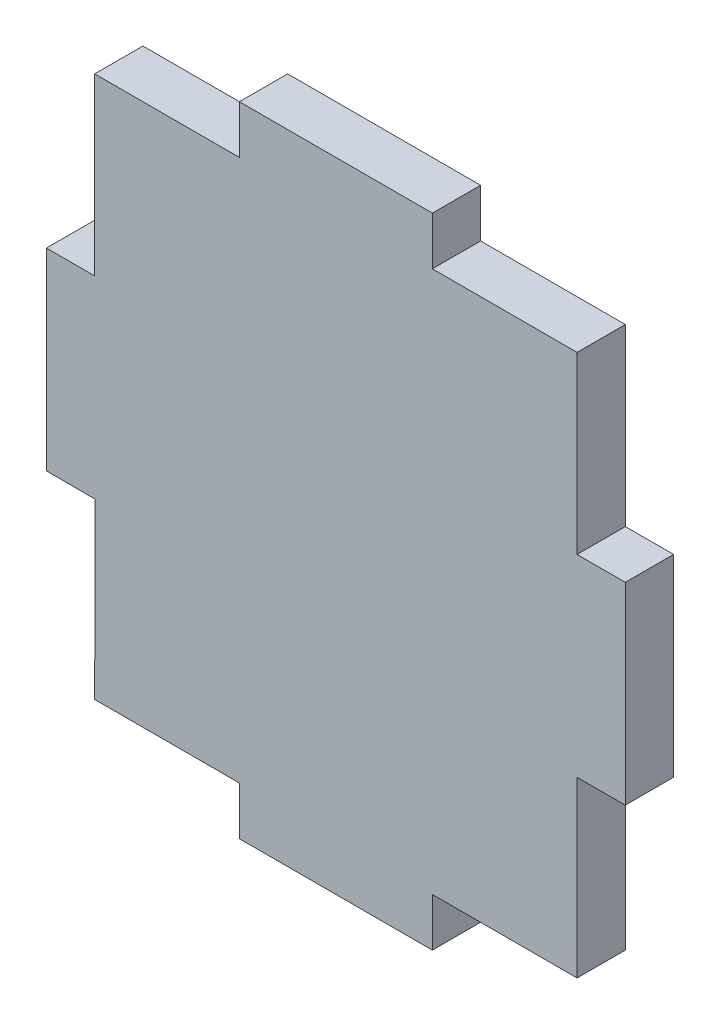
ISO-10303-21;
HEADER;
FILE_DESCRIPTION(('STEP AP214'),'2;1');
FILE_NAME('part.step','',(''),(''),'','','');
FILE_SCHEMA(('AUTOMOTIVE_DESIGN { 1 0 10303 214 1 1 1 1 }'));
ENDSEC;
DATA;
#1=APPLICATION_CONTEXT('core data for automotive mechanical design processes');
#2=APPLICATION_PROTOCOL_DEFINITION('international standard','automotive_design',2000,#1);
#3=PRODUCT_CONTEXT('',#1,'mechanical');
#4=PRODUCT('Part','Part','',(#3));
#5=PRODUCT_RELATED_PRODUCT_CATEGORY('part','',(#4));
#6=PRODUCT_DEFINITION_FORMATION('','',#4);
#7=PRODUCT_DEFINITION_CONTEXT('part definition',#1,'design');
#8=PRODUCT_DEFINITION('design','',#6,#7);
#9=PRODUCT_DEFINITION_SHAPE('','',#8);
#10=(LENGTH_UNIT() NAMED_UNIT(*) SI_UNIT(.MILLI.,.METRE.));
#11=(NAMED_UNIT(*) PLANE_ANGLE_UNIT() SI_UNIT($,.RADIAN.));
#12=(NAMED_UNIT(*) SI_UNIT($,.STERADIAN.) SOLID_ANGLE_UNIT());
#13=UNCERTAINTY_MEASURE_WITH_UNIT(LENGTH_MEASURE(1.E-05),#10,'distance_accuracy_value','');
#14=(GEOMETRIC_REPRESENTATION_CONTEXT(3) GLOBAL_UNCERTAINTY_ASSIGNED_CONTEXT((#13)) GLOBAL_UNIT_ASSIGNED_CONTEXT((#10,
#11,#12)) REPRESENTATION_CONTEXT('',''));
#15=CARTESIAN_POINT('',(0.,0.,0.));
#16=DIRECTION('',(0.,0.,1.));
#17=DIRECTION('',(1.,0.,0.));
#18=AXIS2_PLACEMENT_3D('',#15,#16,#17);
#19=CARTESIAN_POINT('',(823.747024457994,-92.5741594200983,2.5));
#20=DIRECTION('',(0.,-1.,0.));
#21=DIRECTION('',(0.,0.,-1.));
#22=AXIS2_PLACEMENT_3D('',#19,#20,#21);
#23=PLANE('',#22);
#24=DIRECTION('',(-1.,0.,0.));
#25=VECTOR('',#24,1.);
#26=CARTESIAN_POINT('',(823.747024457994,-92.5741594200983,-2.5));
#27=LINE('',#26,#25);
#28=CARTESIAN_POINT('',(838.73553331935,-92.5741594200983,-2.5));
#29=VERTEX_POINT('',#28);
#30=CARTESIAN_POINT('',(823.747024457994,-92.5741594200983,-2.5));
#31=VERTEX_POINT('',#30);
#32=EDGE_CURVE('E201',#29,#31,#27,.T.);
#33=ORIENTED_EDGE('',*,*,#32,.T.);
#34=DIRECTION('',(0.,0.,-1.));
#35=VECTOR('',#34,1.);
#36=CARTESIAN_POINT('',(823.747024457994,-92.5741594200983,2.5));
#37=LINE('',#36,#35);
#38=CARTESIAN_POINT('',(823.747024457994,-92.5741594200983,2.5));
#39=VERTEX_POINT('',#38);
#40=EDGE_CURVE('E11',#39,#31,#37,.T.);
#41=ORIENTED_EDGE('',*,*,#40,.F.);
#42=DIRECTION('',(-1.,0.,0.));
#43=VECTOR('',#42,1.);
#44=CARTESIAN_POINT('',(823.747024457994,-92.5741594200983,2.5));
#45=LINE('',#44,#43);
#46=CARTESIAN_POINT('',(838.73553331935,-92.5741594200983,2.5));
#47=VERTEX_POINT('',#46);
#48=EDGE_CURVE('E239',#47,#39,#45,.T.);
#49=ORIENTED_EDGE('',*,*,#48,.F.);
#50=DIRECTION('',(0.,0.,-1.));
#51=VECTOR('',#50,1.);
#52=CARTESIAN_POINT('',(838.73553331935,-92.5741594200983,2.5));
#53=LINE('',#52,#51);
#54=EDGE_CURVE('E197',#47,#29,#53,.T.);
#55=ORIENTED_EDGE('',*,*,#54,.T.);
#56=EDGE_LOOP('',(#33,#41,#49,#55));
#57=FACE_BOUND('',#56,.T.);
#58=ADVANCED_FACE('F33',(#57),#23,.F.);
#59=CARTESIAN_POINT('',(823.747024457994,-110.711050120496,2.5));
#60=DIRECTION('',(1.,0.,0.));
#61=DIRECTION('',(0.,0.,-1.));
#62=AXIS2_PLACEMENT_3D('',#59,#60,#61);
#63=PLANE('',#62);
#64=DIRECTION('',(0.,-1.,0.));
#65=VECTOR('',#64,1.);
#66=CARTESIAN_POINT('',(823.747024457994,-110.711050120496,-2.5));
#67=LINE('',#66,#65);
#68=CARTESIAN_POINT('',(823.747024457994,-110.711050120496,-2.5));
#69=VERTEX_POINT('',#68);
#70=EDGE_CURVE('E204',#31,#69,#67,.T.);
#71=ORIENTED_EDGE('',*,*,#70,.T.);
#72=DIRECTION('',(0.,0.,-1.));
#73=VECTOR('',#72,1.);
#74=CARTESIAN_POINT('',(823.747024457994,-110.711050120496,2.5));
#75=LINE('',#74,#73);
#76=CARTESIAN_POINT('',(823.747024457994,-110.711050120496,2.5));
#77=VERTEX_POINT('',#76);
#78=EDGE_CURVE('E41',#77,#69,#75,.T.);
#79=ORIENTED_EDGE('',*,*,#78,.F.);
#80=DIRECTION('',(0.,-1.,0.));
#81=VECTOR('',#80,1.);
#82=CARTESIAN_POINT('',(823.747024457994,-110.711050120496,2.5));
#83=LINE('',#82,#81);
#84=EDGE_CURVE('E128',#39,#77,#83,.T.);
#85=ORIENTED_EDGE('',*,*,#84,.F.);
#86=ORIENTED_EDGE('',*,*,#40,.T.);
#87=EDGE_LOOP('',(#71,#79,#85,#86));
#88=FACE_BOUND('',#87,.T.);
#89=ADVANCED_FACE('F357',(#88),#63,.F.);
#90=CARTESIAN_POINT('',(818.747024457994,-110.711050120496,2.5));
#91=DIRECTION('',(0.,-1.,0.));
#92=DIRECTION('',(0.,0.,-1.));
#93=AXIS2_PLACEMENT_3D('',#90,#91,#92);
#94=PLANE('',#93);
#95=DIRECTION('',(-1.,0.,0.));
#96=VECTOR('',#95,1.);
#97=CARTESIAN_POINT('',(818.747024457994,-110.711050120496,-2.5));
#98=LINE('',#97,#96);
#99=CARTESIAN_POINT('',(818.747024457994,-110.711050120496,-2.5));
#100=VERTEX_POINT('',#99);
#101=EDGE_CURVE('E206',#69,#100,#98,.T.);
#102=ORIENTED_EDGE('',*,*,#101,.T.);
#103=DIRECTION('',(0.,0.,-1.));
#104=VECTOR('',#103,1.);
#105=CARTESIAN_POINT('',(818.747024457994,-110.711050120496,2.5));
#106=LINE('',#105,#104);
#107=CARTESIAN_POINT('',(818.747024457994,-110.711050120496,2.5));
#108=VERTEX_POINT('',#107);
#109=EDGE_CURVE('E282',#108,#100,#106,.T.);
#110=ORIENTED_EDGE('',*,*,#109,.F.);
#111=DIRECTION('',(-1.,0.,0.));
#112=VECTOR('',#111,1.);
#113=CARTESIAN_POINT('',(818.747024457994,-110.711050120496,2.5));
#114=LINE('',#113,#112);
#115=EDGE_CURVE('E290',#77,#108,#114,.T.);
#116=ORIENTED_EDGE('',*,*,#115,.F.);
#117=ORIENTED_EDGE('',*,*,#78,.T.);
#118=EDGE_LOOP('',(#102,#110,#116,#117));
#119=FACE_BOUND('',#118,.T.);
#120=ADVANCED_FACE('F288',(#119),#94,.F.);
#121=CARTESIAN_POINT('',(818.747024457994,-130.711050120495,2.5));
#122=DIRECTION('',(1.,0.,0.));
#123=DIRECTION('',(0.,0.,-1.));
#124=AXIS2_PLACEMENT_3D('',#121,#122,#123);
#125=PLANE('',#124);
#126=DIRECTION('',(0.,-1.,0.));
#127=VECTOR('',#126,1.);
#128=CARTESIAN_POINT('',(818.747024457994,-130.711050120495,-2.5));
#129=LINE('',#128,#127);
#130=CARTESIAN_POINT('',(818.747024457994,-130.711050120495,-2.5));
#131=VERTEX_POINT('',#130);
#132=EDGE_CURVE('E208',#100,#131,#129,.T.);
#133=ORIENTED_EDGE('',*,*,#132,.T.);
#134=DIRECTION('',(0.,0.,-1.));
#135=VECTOR('',#134,1.);
#136=CARTESIAN_POINT('',(818.747024457994,-130.711050120495,2.5));
#137=LINE('',#136,#135);
#138=CARTESIAN_POINT('',(818.747024457994,-130.711050120495,2.5));
#139=VERTEX_POINT('',#138);
#140=EDGE_CURVE('E279',#139,#131,#137,.T.);
#141=ORIENTED_EDGE('',*,*,#140,.F.);
#142=DIRECTION('',(0.,-1.,0.));
#143=VECTOR('',#142,1.);
#144=CARTESIAN_POINT('',(818.747024457994,-130.711050120495,2.5));
#145=LINE('',#144,#143);
#146=EDGE_CURVE('E308',#108,#139,#145,.T.);
#147=ORIENTED_EDGE('',*,*,#146,.F.);
#148=ORIENTED_EDGE('',*,*,#109,.T.);
#149=EDGE_LOOP('',(#133,#141,#147,#148));
#150=FACE_BOUND('',#149,.T.);
#151=ADVANCED_FACE('F299',(#150),#125,.F.);
#152=CARTESIAN_POINT('',(823.788794943196,-130.722745844925,2.5));
#153=DIRECTION('',(0.00231975909954067,0.99999730935524,0.));
#154=DIRECTION('',(-0.99999730935524,0.00231975909954067,0.));
#155=AXIS2_PLACEMENT_3D('',#152,#153,#154);
#156=PLANE('',#155);
#157=DIRECTION('',(0.99999730935524,-0.00231975909954067,0.));
#158=VECTOR('',#157,1.);
#159=CARTESIAN_POINT('',(823.788794943196,-130.722745844925,-2.5));
#160=LINE('',#159,#158);
#161=CARTESIAN_POINT('',(823.788794943196,-130.722745844925,-2.5));
#162=VERTEX_POINT('',#161);
#163=EDGE_CURVE('E210',#131,#162,#160,.T.);
#164=ORIENTED_EDGE('',*,*,#163,.T.);
#165=DIRECTION('',(0.,0.,-1.));
#166=VECTOR('',#165,1.);
#167=CARTESIAN_POINT('',(823.788794943196,-130.722745844925,2.5));
#168=LINE('',#167,#166);
#169=CARTESIAN_POINT('',(823.788794943196,-130.722745844925,2.5));
#170=VERTEX_POINT('',#169);
#171=EDGE_CURVE('E276',#170,#162,#168,.T.);
#172=ORIENTED_EDGE('',*,*,#171,.F.);
#173=DIRECTION('',(0.99999730935524,-0.00231975909954067,0.));
#174=VECTOR('',#173,1.);
#175=CARTESIAN_POINT('',(823.788794943196,-130.722745844925,2.5));
#176=LINE('',#175,#174);
#177=EDGE_CURVE('E305',#139,#170,#176,.T.);
#178=ORIENTED_EDGE('',*,*,#177,.F.);
#179=ORIENTED_EDGE('',*,*,#140,.T.);
#180=EDGE_LOOP('',(#164,#172,#178,#179));
#181=FACE_BOUND('',#180,.T.);
#182=ADVANCED_FACE('F303',(#181),#156,.F.);
#183=CARTESIAN_POINT('',(823.747024457993,-148.729086598929,2.5));
#184=DIRECTION('',(0.99999730935524,-0.00231975909956387,0.));
#185=DIRECTION('',(0.00231975909956387,0.99999730935524,0.));
#186=AXIS2_PLACEMENT_3D('',#183,#184,#185);
#187=PLANE('',#186);
#188=DIRECTION('',(-0.00231975909956387,-0.99999730935524,0.));
#189=VECTOR('',#188,1.);
#190=CARTESIAN_POINT('',(823.747024457993,-148.729086598929,-2.5));
#191=LINE('',#190,#189);
#192=CARTESIAN_POINT('',(823.747024457993,-148.729086598929,-2.5));
#193=VERTEX_POINT('',#192);
#194=EDGE_CURVE('E212',#162,#193,#191,.T.);
#195=ORIENTED_EDGE('',*,*,#194,.T.);
#196=DIRECTION('',(0.,0.,-1.));
#197=VECTOR('',#196,1.);
#198=CARTESIAN_POINT('',(823.747024457993,-148.729086598929,2.5));
#199=LINE('',#198,#197);
#200=CARTESIAN_POINT('',(823.747024457993,-148.729086598929,2.5));
#201=VERTEX_POINT('',#200);
#202=EDGE_CURVE('E273',#201,#193,#199,.T.);
#203=ORIENTED_EDGE('',*,*,#202,.F.);
#204=DIRECTION('',(-0.00231975909956387,-0.99999730935524,0.));
#205=VECTOR('',#204,1.);
#206=CARTESIAN_POINT('',(823.747024457993,-148.729086598929,2.5));
#207=LINE('',#206,#205);
#208=EDGE_CURVE('E307',#170,#201,#207,.T.);
#209=ORIENTED_EDGE('',*,*,#208,.F.);
#210=ORIENTED_EDGE('',*,*,#171,.T.);
#211=EDGE_LOOP('',(#195,#203,#209,#210));
#212=FACE_BOUND('',#211,.T.);
#213=ADVANCED_FACE('F370',(#212),#187,.F.);
#214=CARTESIAN_POINT('',(838.735533380043,-148.729113008043,2.5));
#215=DIRECTION('',(1.76195737716668E-06,0.999999999998448,0.));
#216=DIRECTION('',(-0.999999999998448,1.76195737716668E-06,0.));
#217=AXIS2_PLACEMENT_3D('',#214,#215,#216);
#218=PLANE('',#217);
#219=DIRECTION('',(0.999999999998448,-1.76195737716667E-06,0.));
#220=VECTOR('',#219,1.);
#221=CARTESIAN_POINT('',(838.735533380043,-148.729113008043,-2.5));
#222=LINE('',#221,#220);
#223=CARTESIAN_POINT('',(838.735533380043,-148.729113008043,-2.5));
#224=VERTEX_POINT('',#223);
#225=EDGE_CURVE('E214',#193,#224,#222,.T.);
#226=ORIENTED_EDGE('',*,*,#225,.T.);
#227=DIRECTION('',(0.,0.,-1.));
#228=VECTOR('',#227,1.);
#229=CARTESIAN_POINT('',(838.735533380043,-148.729113008043,2.5));
#230=LINE('',#229,#228);
#231=CARTESIAN_POINT('',(838.735533380043,-148.729113008043,2.5));
#232=VERTEX_POINT('',#231);
#233=EDGE_CURVE('E270',#232,#224,#230,.T.);
#234=ORIENTED_EDGE('',*,*,#233,.F.);
#235=DIRECTION('',(0.999999999998448,-1.76195737716667E-06,0.));
#236=VECTOR('',#235,1.);
#237=CARTESIAN_POINT('',(838.735533380043,-148.729113008043,2.5));
#238=LINE('',#237,#236);
#239=EDGE_CURVE('E310',#201,#232,#238,.T.);
#240=ORIENTED_EDGE('',*,*,#239,.F.);
#241=ORIENTED_EDGE('',*,*,#202,.T.);
#242=EDGE_LOOP('',(#226,#234,#240,#241));
#243=FACE_BOUND('',#242,.T.);
#244=ADVANCED_FACE('F373',(#243),#218,.F.);
#245=CARTESIAN_POINT('',(838.735533380043,-148.729113008043,2.5));
#246=DIRECTION('',(0.999997359085114,0.00229822165959848,0.));
#247=DIRECTION('',(-0.00229822165959848,0.999997359085114,0.));
#248=AXIS2_PLACEMENT_3D('',#245,#246,#247);
#249=PLANE('',#248);
#250=DIRECTION('',(0.00229822165959848,-0.999997359085115,0.));
#251=VECTOR('',#250,1.);
#252=CARTESIAN_POINT('',(838.735533380043,-148.729113008043,-2.5));
#253=LINE('',#252,#251);
#254=CARTESIAN_POINT('',(838.747024457994,-153.729086598929,-2.5));
#255=VERTEX_POINT('',#254);
#256=EDGE_CURVE('E216',#224,#255,#253,.T.);
#257=ORIENTED_EDGE('',*,*,#256,.T.);
#258=DIRECTION('',(0.,0.,-1.));
#259=VECTOR('',#258,1.);
#260=CARTESIAN_POINT('',(838.747024457994,-153.729086598929,2.5));
#261=LINE('',#260,#259);
#262=CARTESIAN_POINT('',(838.747024457994,-153.729086598929,2.5));
#263=VERTEX_POINT('',#262);
#264=EDGE_CURVE('E267',#263,#255,#261,.T.);
#265=ORIENTED_EDGE('',*,*,#264,.F.);
#266=DIRECTION('',(0.00229822165959848,-0.999997359085115,0.));
#267=VECTOR('',#266,1.);
#268=CARTESIAN_POINT('',(838.735533380043,-148.729113008043,2.5));
#269=LINE('',#268,#267);
#270=EDGE_CURVE('E316',#232,#263,#269,.T.);
#271=ORIENTED_EDGE('',*,*,#270,.F.);
#272=ORIENTED_EDGE('',*,*,#233,.T.);
#273=EDGE_LOOP('',(#257,#265,#271,#272));
#274=FACE_BOUND('',#273,.T.);
#275=ADVANCED_FACE('F377',(#274),#249,.F.);
#276=CARTESIAN_POINT('',(838.747024457994,-153.729086598929,2.5));
#277=DIRECTION('',(0.,1.,0.));
#278=DIRECTION('',(0.,0.,1.));
#279=AXIS2_PLACEMENT_3D('',#276,#277,#278);
#280=PLANE('',#279);
#281=DIRECTION('',(1.,0.,0.));
#282=VECTOR('',#281,1.);
#283=CARTESIAN_POINT('',(838.747024457994,-153.729086598929,-2.5));
#284=LINE('',#283,#282);
#285=CARTESIAN_POINT('',(858.747024457992,-153.729086598929,-2.5));
#286=VERTEX_POINT('',#285);
#287=EDGE_CURVE('E218',#255,#286,#284,.T.);
#288=ORIENTED_EDGE('',*,*,#287,.T.);
#289=DIRECTION('',(0.,0.,-1.));
#290=VECTOR('',#289,1.);
#291=CARTESIAN_POINT('',(858.747024457992,-153.729086598929,2.5));
#292=LINE('',#291,#290);
#293=CARTESIAN_POINT('',(858.747024457992,-153.729086598929,2.5));
#294=VERTEX_POINT('',#293);
#295=EDGE_CURVE('E264',#294,#286,#292,.T.);
#296=ORIENTED_EDGE('',*,*,#295,.F.);
#297=DIRECTION('',(1.,0.,0.));
#298=VECTOR('',#297,1.);
#299=CARTESIAN_POINT('',(838.747024457994,-153.729086598929,2.5));
#300=LINE('',#299,#298);
#301=EDGE_CURVE('E318',#263,#294,#300,.T.);
#302=ORIENTED_EDGE('',*,*,#301,.F.);
#303=ORIENTED_EDGE('',*,*,#264,.T.);
#304=EDGE_LOOP('',(#288,#296,#302,#303));
#305=FACE_BOUND('',#304,.T.);
#306=ADVANCED_FACE('F381',(#305),#280,.F.);
#307=CARTESIAN_POINT('',(858.747024457992,-153.729086598929,2.5));
#308=DIRECTION('',(-1.,0.,0.));
#309=DIRECTION('',(0.,0.,1.));
#310=AXIS2_PLACEMENT_3D('',#307,#308,#309);
#311=PLANE('',#310);
#312=DIRECTION('',(0.,1.,0.));
#313=VECTOR('',#312,1.);
#314=CARTESIAN_POINT('',(858.747024457992,-153.729086598929,-2.5));
#315=LINE('',#314,#313);
#316=CARTESIAN_POINT('',(858.747024457992,-148.729086598929,-2.5));
#317=VERTEX_POINT('',#316);
#318=EDGE_CURVE('E220',#286,#317,#315,.T.);
#319=ORIENTED_EDGE('',*,*,#318,.T.);
#320=DIRECTION('',(0.,0.,-1.));
#321=VECTOR('',#320,1.);
#322=CARTESIAN_POINT('',(858.747024457992,-148.729086598929,2.5));
#323=LINE('',#322,#321);
#324=CARTESIAN_POINT('',(858.747024457992,-148.729086598929,2.5));
#325=VERTEX_POINT('',#324);
#326=EDGE_CURVE('E261',#325,#317,#323,.T.);
#327=ORIENTED_EDGE('',*,*,#326,.F.);
#328=DIRECTION('',(0.,1.,0.));
#329=VECTOR('',#328,1.);
#330=CARTESIAN_POINT('',(858.747024457992,-153.729086598929,2.5));
#331=LINE('',#330,#329);
#332=EDGE_CURVE('E320',#294,#325,#331,.T.);
#333=ORIENTED_EDGE('',*,*,#332,.F.);
#334=ORIENTED_EDGE('',*,*,#295,.T.);
#335=EDGE_LOOP('',(#319,#327,#333,#334));
#336=FACE_BOUND('',#335,.T.);
#337=ADVANCED_FACE('F385',(#336),#311,.F.);
#338=CARTESIAN_POINT('',(858.747024457992,-148.729086598929,2.5));
#339=DIRECTION('',(0.,1.,0.));
#340=DIRECTION('',(0.,0.,1.));
#341=AXIS2_PLACEMENT_3D('',#338,#339,#340);
#342=PLANE('',#341);
#343=DIRECTION('',(1.,0.,0.));
#344=VECTOR('',#343,1.);
#345=CARTESIAN_POINT('',(858.747024457992,-148.729086598929,-2.5));
#346=LINE('',#345,#344);
#347=CARTESIAN_POINT('',(873.747024457993,-148.729086598929,-2.5));
#348=VERTEX_POINT('',#347);
#349=EDGE_CURVE('E222',#317,#348,#346,.T.);
#350=ORIENTED_EDGE('',*,*,#349,.T.);
#351=DIRECTION('',(0.,0.,-1.));
#352=VECTOR('',#351,1.);
#353=CARTESIAN_POINT('',(873.747024457993,-148.729086598929,2.5));
#354=LINE('',#353,#352);
#355=CARTESIAN_POINT('',(873.747024457993,-148.729086598929,2.5));
#356=VERTEX_POINT('',#355);
#357=EDGE_CURVE('E258',#356,#348,#354,.T.);
#358=ORIENTED_EDGE('',*,*,#357,.F.);
#359=DIRECTION('',(1.,0.,0.));
#360=VECTOR('',#359,1.);
#361=CARTESIAN_POINT('',(858.747024457992,-148.729086598929,2.5));
#362=LINE('',#361,#360);
#363=EDGE_CURVE('E322',#325,#356,#362,.T.);
#364=ORIENTED_EDGE('',*,*,#363,.F.);
#365=ORIENTED_EDGE('',*,*,#326,.T.);
#366=EDGE_LOOP('',(#350,#358,#364,#365));
#367=FACE_BOUND('',#366,.T.);
#368=ADVANCED_FACE('F389',(#367),#342,.F.);
#369=CARTESIAN_POINT('',(873.747024457993,-148.729086598929,2.5));
#370=DIRECTION('',(-0.999999999999731,7.3331991585348E-07,0.));
#371=DIRECTION('',(-7.3331991585348E-07,-0.999999999999731,0.));
#372=AXIS2_PLACEMENT_3D('',#369,#370,#371);
#373=PLANE('',#372);
#374=DIRECTION('',(7.3331991585348E-07,0.999999999999731,0.));
#375=VECTOR('',#374,1.);
#376=CARTESIAN_POINT('',(873.747024457993,-148.729086598929,-2.5));
#377=LINE('',#376,#375);
#378=CARTESIAN_POINT('',(873.747037662552,-130.722541228792,-2.5));
#379=VERTEX_POINT('',#378);
#380=EDGE_CURVE('E224',#348,#379,#377,.T.);
#381=ORIENTED_EDGE('',*,*,#380,.T.);
#382=DIRECTION('',(0.,0.,-1.));
#383=VECTOR('',#382,1.);
#384=CARTESIAN_POINT('',(873.747037662552,-130.722541228792,2.5));
#385=LINE('',#384,#383);
#386=CARTESIAN_POINT('',(873.747037662552,-130.722541228792,2.5));
#387=VERTEX_POINT('',#386);
#388=EDGE_CURVE('E255',#387,#379,#385,.T.);
#389=ORIENTED_EDGE('',*,*,#388,.F.);
#390=DIRECTION('',(7.3331991585348E-07,0.999999999999731,0.));
#391=VECTOR('',#390,1.);
#392=CARTESIAN_POINT('',(873.747024457993,-148.729086598929,2.5));
#393=LINE('',#392,#391);
#394=EDGE_CURVE('E324',#356,#387,#393,.T.);
#395=ORIENTED_EDGE('',*,*,#394,.F.);
#396=ORIENTED_EDGE('',*,*,#357,.T.);
#397=EDGE_LOOP('',(#381,#389,#395,#396));
#398=FACE_BOUND('',#397,.T.);
#399=ADVANCED_FACE('F393',(#398),#373,.F.);
#400=CARTESIAN_POINT('',(878.747024457993,-130.711050120495,2.5));
#401=DIRECTION('',(-0.00229822165928955,0.999997359085115,0.));
#402=DIRECTION('',(-0.999997359085115,-0.00229822165928955,0.));
#403=AXIS2_PLACEMENT_3D('',#400,#401,#402);
#404=PLANE('',#403);
#405=DIRECTION('',(0.999997359085115,0.00229822165928955,0.));
#406=VECTOR('',#405,1.);
#407=CARTESIAN_POINT('',(878.747024457993,-130.711050120495,-2.5));
#408=LINE('',#407,#406);
#409=CARTESIAN_POINT('',(878.747024457993,-130.711050120495,-2.5));
#410=VERTEX_POINT('',#409);
#411=EDGE_CURVE('E226',#379,#410,#408,.T.);
#412=ORIENTED_EDGE('',*,*,#411,.T.);
#413=DIRECTION('',(0.,0.,-1.));
#414=VECTOR('',#413,1.);
#415=CARTESIAN_POINT('',(878.747024457993,-130.711050120495,2.5));
#416=LINE('',#415,#414);
#417=CARTESIAN_POINT('',(878.747024457993,-130.711050120495,2.5));
#418=VERTEX_POINT('',#417);
#419=EDGE_CURVE('E252',#418,#410,#416,.T.);
#420=ORIENTED_EDGE('',*,*,#419,.F.);
#421=DIRECTION('',(0.999997359085115,0.00229822165928955,0.));
#422=VECTOR('',#421,1.);
#423=CARTESIAN_POINT('',(878.747024457993,-130.711050120495,2.5));
#424=LINE('',#423,#422);
#425=EDGE_CURVE('E326',#387,#418,#424,.T.);
#426=ORIENTED_EDGE('',*,*,#425,.F.);
#427=ORIENTED_EDGE('',*,*,#388,.T.);
#428=EDGE_LOOP('',(#412,#420,#426,#427));
#429=FACE_BOUND('',#428,.T.);
#430=ADVANCED_FACE('F397',(#429),#404,.F.);
#431=CARTESIAN_POINT('',(878.747024457993,-110.711050120496,2.5));
#432=DIRECTION('',(-1.,0.,0.));
#433=DIRECTION('',(0.,0.,1.));
#434=AXIS2_PLACEMENT_3D('',#431,#432,#433);
#435=PLANE('',#434);
#436=DIRECTION('',(0.,1.,0.));
#437=VECTOR('',#436,1.);
#438=CARTESIAN_POINT('',(878.747024457993,-110.711050120496,-2.5));
#439=LINE('',#438,#437);
#440=CARTESIAN_POINT('',(878.747024457993,-110.711050120496,-2.5));
#441=VERTEX_POINT('',#440);
#442=EDGE_CURVE('E228',#410,#441,#439,.T.);
#443=ORIENTED_EDGE('',*,*,#442,.T.);
#444=DIRECTION('',(0.,0.,-1.));
#445=VECTOR('',#444,1.);
#446=CARTESIAN_POINT('',(878.747024457993,-110.711050120496,2.5));
#447=LINE('',#446,#445);
#448=CARTESIAN_POINT('',(878.747024457993,-110.711050120496,2.5));
#449=VERTEX_POINT('',#448);
#450=EDGE_CURVE('E249',#449,#441,#447,.T.);
#451=ORIENTED_EDGE('',*,*,#450,.F.);
#452=DIRECTION('',(0.,1.,0.));
#453=VECTOR('',#452,1.);
#454=CARTESIAN_POINT('',(878.747024457993,-110.711050120496,2.5));
#455=LINE('',#454,#453);
#456=EDGE_CURVE('E328',#418,#449,#455,.T.);
#457=ORIENTED_EDGE('',*,*,#456,.F.);
#458=ORIENTED_EDGE('',*,*,#419,.T.);
#459=EDGE_LOOP('',(#443,#451,#457,#458));
#460=FACE_BOUND('',#459,.T.);
#461=ADVANCED_FACE('F401',(#460),#435,.F.);
#462=CARTESIAN_POINT('',(873.747024457995,-110.711050120496,2.5));
#463=DIRECTION('',(0.,-1.,0.));
#464=DIRECTION('',(0.,0.,-1.));
#465=AXIS2_PLACEMENT_3D('',#462,#463,#464);
#466=PLANE('',#465);
#467=DIRECTION('',(-1.,0.,0.));
#468=VECTOR('',#467,1.);
#469=CARTESIAN_POINT('',(873.747024457995,-110.711050120496,-2.5));
#470=LINE('',#469,#468);
#471=CARTESIAN_POINT('',(873.747024457995,-110.711050120496,-2.5));
#472=VERTEX_POINT('',#471);
#473=EDGE_CURVE('E230',#441,#472,#470,.T.);
#474=ORIENTED_EDGE('',*,*,#473,.T.);
#475=DIRECTION('',(0.,0.,-1.));
#476=VECTOR('',#475,1.);
#477=CARTESIAN_POINT('',(873.747024457995,-110.711050120496,2.5));
#478=LINE('',#477,#476);
#479=CARTESIAN_POINT('',(873.747024457995,-110.711050120496,2.5));
#480=VERTEX_POINT('',#479);
#481=EDGE_CURVE('E246',#480,#472,#478,.T.);
#482=ORIENTED_EDGE('',*,*,#481,.F.);
#483=DIRECTION('',(-1.,0.,0.));
#484=VECTOR('',#483,1.);
#485=CARTESIAN_POINT('',(873.747024457995,-110.711050120496,2.5));
#486=LINE('',#485,#484);
#487=EDGE_CURVE('E330',#449,#480,#486,.T.);
#488=ORIENTED_EDGE('',*,*,#487,.F.);
#489=ORIENTED_EDGE('',*,*,#450,.T.);
#490=EDGE_LOOP('',(#474,#482,#488,#489));
#491=FACE_BOUND('',#490,.T.);
#492=ADVANCED_FACE('F405',(#491),#466,.F.);
#493=CARTESIAN_POINT('',(873.747024457993,-92.5741594200983,2.5));
#494=DIRECTION('',(-1.,0.,0.));
#495=DIRECTION('',(0.,-1.,0.));
#496=AXIS2_PLACEMENT_3D('',#493,#494,#495);
#497=PLANE('',#496);
#498=DIRECTION('',(0.,1.,0.));
#499=VECTOR('',#498,1.);
#500=CARTESIAN_POINT('',(873.747024457993,-92.5741594200983,-2.5));
#501=LINE('',#500,#499);
#502=CARTESIAN_POINT('',(873.747024457993,-92.5741594200983,-2.5));
#503=VERTEX_POINT('',#502);
#504=EDGE_CURVE('E232',#472,#503,#501,.T.);
#505=ORIENTED_EDGE('',*,*,#504,.T.);
#506=DIRECTION('',(0.,0.,-1.));
#507=VECTOR('',#506,1.);
#508=CARTESIAN_POINT('',(873.747024457993,-92.5741594200983,2.5));
#509=LINE('',#508,#507);
#510=CARTESIAN_POINT('',(873.747024457993,-92.5741594200983,2.5));
#511=VERTEX_POINT('',#510);
#512=EDGE_CURVE('E243',#511,#503,#509,.T.);
#513=ORIENTED_EDGE('',*,*,#512,.F.);
#514=DIRECTION('',(0.,1.,0.));
#515=VECTOR('',#514,1.);
#516=CARTESIAN_POINT('',(873.747024457993,-92.5741594200983,2.5));
#517=LINE('',#516,#515);
#518=EDGE_CURVE('E332',#480,#511,#517,.T.);
#519=ORIENTED_EDGE('',*,*,#518,.F.);
#520=ORIENTED_EDGE('',*,*,#481,.T.);
#521=EDGE_LOOP('',(#505,#513,#519,#520));
#522=FACE_BOUND('',#521,.T.);
#523=ADVANCED_FACE('F338',(#522),#497,.F.);
#524=CARTESIAN_POINT('',(858.747024457992,-92.5741594200983,2.5));
#525=DIRECTION('',(0.,-1.,0.));
#526=DIRECTION('',(0.,0.,-1.));
#527=AXIS2_PLACEMENT_3D('',#524,#525,#526);
#528=PLANE('',#527);
#529=DIRECTION('',(-1.,0.,0.));
#530=VECTOR('',#529,1.);
#531=CARTESIAN_POINT('',(858.747024457992,-92.5741594200983,-2.5));
#532=LINE('',#531,#530);
#533=CARTESIAN_POINT('',(858.747024457992,-92.5741594200983,-2.5));
#534=VERTEX_POINT('',#533);
#535=EDGE_CURVE('E234',#503,#534,#532,.T.);
#536=ORIENTED_EDGE('',*,*,#535,.T.);
#537=DIRECTION('',(0.,0.,-1.));
#538=VECTOR('',#537,1.);
#539=CARTESIAN_POINT('',(858.747024457992,-92.5741594200983,2.5));
#540=LINE('',#539,#538);
#541=CARTESIAN_POINT('',(858.747024457992,-92.5741594200983,2.5));
#542=VERTEX_POINT('',#541);
#543=EDGE_CURVE('E192',#542,#534,#540,.T.);
#544=ORIENTED_EDGE('',*,*,#543,.F.);
#545=DIRECTION('',(-1.,0.,0.));
#546=VECTOR('',#545,1.);
#547=CARTESIAN_POINT('',(858.747024457992,-92.5741594200983,2.5));
#548=LINE('',#547,#546);
#549=EDGE_CURVE('E183',#511,#542,#548,.T.);
#550=ORIENTED_EDGE('',*,*,#549,.F.);
#551=ORIENTED_EDGE('',*,*,#512,.T.);
#552=EDGE_LOOP('',(#536,#544,#550,#551));
#553=FACE_BOUND('',#552,.T.);
#554=ADVANCED_FACE('F342',(#553),#528,.F.);
#555=CARTESIAN_POINT('',(858.747024457992,-87.5741594200983,2.5));
#556=DIRECTION('',(-1.,0.,0.));
#557=DIRECTION('',(0.,0.,1.));
#558=AXIS2_PLACEMENT_3D('',#555,#556,#557);
#559=PLANE('',#558);
#560=DIRECTION('',(0.,1.,0.));
#561=VECTOR('',#560,1.);
#562=CARTESIAN_POINT('',(858.747024457992,-87.5741594200983,-2.5));
#563=LINE('',#562,#561);
#564=CARTESIAN_POINT('',(858.747024457992,-87.5741594200983,-2.5));
#565=VERTEX_POINT('',#564);
#566=EDGE_CURVE('E191',#534,#565,#563,.T.);
#567=ORIENTED_EDGE('',*,*,#566,.T.);
#568=DIRECTION('',(0.,0.,-1.));
#569=VECTOR('',#568,1.);
#570=CARTESIAN_POINT('',(858.747024457992,-87.5741594200983,2.5));
#571=LINE('',#570,#569);
#572=CARTESIAN_POINT('',(858.747024457992,-87.5741594200983,2.5));
#573=VERTEX_POINT('',#572);
#574=EDGE_CURVE('E188',#573,#565,#571,.T.);
#575=ORIENTED_EDGE('',*,*,#574,.F.);
#576=DIRECTION('',(0.,1.,0.));
#577=VECTOR('',#576,1.);
#578=CARTESIAN_POINT('',(858.747024457992,-87.5741594200983,2.5));
#579=LINE('',#578,#577);
#580=EDGE_CURVE('E177',#542,#573,#579,.T.);
#581=ORIENTED_EDGE('',*,*,#580,.F.);
#582=ORIENTED_EDGE('',*,*,#543,.T.);
#583=EDGE_LOOP('',(#567,#575,#581,#582));
#584=FACE_BOUND('',#583,.T.);
#585=ADVANCED_FACE('F189',(#584),#559,.F.);
#586=CARTESIAN_POINT('',(838.747024457994,-87.5741594200983,2.5));
#587=DIRECTION('',(0.,-1.,0.));
#588=DIRECTION('',(0.,0.,-1.));
#589=AXIS2_PLACEMENT_3D('',#586,#587,#588);
#590=PLANE('',#589);
#591=DIRECTION('',(-1.,0.,0.));
#592=VECTOR('',#591,1.);
#593=CARTESIAN_POINT('',(838.747024457994,-87.5741594200983,-2.5));
#594=LINE('',#593,#592);
#595=CARTESIAN_POINT('',(838.747024457994,-87.5741594200983,-2.5));
#596=VERTEX_POINT('',#595);
#597=EDGE_CURVE('E114',#565,#596,#594,.T.);
#598=ORIENTED_EDGE('',*,*,#597,.T.);
#599=DIRECTION('',(0.,0.,-1.));
#600=VECTOR('',#599,1.);
#601=CARTESIAN_POINT('',(838.747024457994,-87.5741594200983,2.5));
#602=LINE('',#601,#600);
#603=CARTESIAN_POINT('',(838.747024457994,-87.5741594200983,2.5));
#604=VERTEX_POINT('',#603);
#605=EDGE_CURVE('E193',#604,#596,#602,.T.);
#606=ORIENTED_EDGE('',*,*,#605,.F.);
#607=DIRECTION('',(-1.,0.,0.));
#608=VECTOR('',#607,1.);
#609=CARTESIAN_POINT('',(838.747024457994,-87.5741594200983,2.5));
#610=LINE('',#609,#608);
#611=EDGE_CURVE('E181',#573,#604,#610,.T.);
#612=ORIENTED_EDGE('',*,*,#611,.F.);
#613=ORIENTED_EDGE('',*,*,#574,.T.);
#614=EDGE_LOOP('',(#598,#606,#612,#613));
#615=FACE_BOUND('',#614,.T.);
#616=ADVANCED_FACE('F195',(#615),#590,.F.);
#617=CARTESIAN_POINT('',(838.73553331935,-92.5741594200983,2.5));
#618=DIRECTION('',(0.999997359085115,-0.00229822165927935,0.));
#619=DIRECTION('',(0.00229822165927935,0.999997359085115,0.));
#620=AXIS2_PLACEMENT_3D('',#617,#618,#619);
#621=PLANE('',#620);
#622=DIRECTION('',(-0.00229822165927935,-0.999997359085115,0.));
#623=VECTOR('',#622,1.);
#624=CARTESIAN_POINT('',(838.73553331935,-92.5741594200983,-2.5));
#625=LINE('',#624,#623);
#626=EDGE_CURVE('E120',#596,#29,#625,.T.);
#627=ORIENTED_EDGE('',*,*,#626,.T.);
#628=ORIENTED_EDGE('',*,*,#54,.F.);
#629=DIRECTION('',(-0.00229822165927935,-0.999997359085115,0.));
#630=VECTOR('',#629,1.);
#631=CARTESIAN_POINT('',(838.73553331935,-92.5741594200983,2.5));
#632=LINE('',#631,#630);
#633=EDGE_CURVE('E49',#604,#47,#632,.T.);
#634=ORIENTED_EDGE('',*,*,#633,.F.);
#635=ORIENTED_EDGE('',*,*,#605,.T.);
#636=EDGE_LOOP('',(#627,#628,#634,#635));
#637=FACE_BOUND('',#636,.T.);
#638=ADVANCED_FACE('F346',(#637),#621,.F.);
#639=CARTESIAN_POINT('',(0.,0.,2.5));
#640=DIRECTION('',(0.,0.,-1.));
#641=DIRECTION('',(-1.,0.,0.));
#642=AXIS2_PLACEMENT_3D('',#639,#640,#641);
#643=PLANE('',#642);
#644=ORIENTED_EDGE('',*,*,#48,.T.);
#645=ORIENTED_EDGE('',*,*,#84,.T.);
#646=ORIENTED_EDGE('',*,*,#115,.T.);
#647=ORIENTED_EDGE('',*,*,#146,.T.);
#648=ORIENTED_EDGE('',*,*,#177,.T.);
#649=ORIENTED_EDGE('',*,*,#208,.T.);
#650=ORIENTED_EDGE('',*,*,#239,.T.);
#651=ORIENTED_EDGE('',*,*,#270,.T.);
#652=ORIENTED_EDGE('',*,*,#301,.T.);
#653=ORIENTED_EDGE('',*,*,#332,.T.);
#654=ORIENTED_EDGE('',*,*,#363,.T.);
#655=ORIENTED_EDGE('',*,*,#394,.T.);
#656=ORIENTED_EDGE('',*,*,#425,.T.);
#657=ORIENTED_EDGE('',*,*,#456,.T.);
#658=ORIENTED_EDGE('',*,*,#487,.T.);
#659=ORIENTED_EDGE('',*,*,#518,.T.);
#660=ORIENTED_EDGE('',*,*,#549,.T.);
#661=ORIENTED_EDGE('',*,*,#580,.T.);
#662=ORIENTED_EDGE('',*,*,#611,.T.);
#663=ORIENTED_EDGE('',*,*,#633,.T.);
#664=EDGE_LOOP('',(#644,#645,#646,#647,#648,#649,#650,#651,#652,#653,#654,#655,#656,#657,#658,
#659,#660,#661,#662,#663));
#665=FACE_BOUND('',#664,.T.);
#666=ADVANCED_FACE('F179',(#665),#643,.F.);
#667=CARTESIAN_POINT('',(0.,0.,-2.5));
#668=DIRECTION('',(0.,0.,-1.));
#669=DIRECTION('',(-1.,0.,0.));
#670=AXIS2_PLACEMENT_3D('',#667,#668,#669);
#671=PLANE('',#670);
#672=ORIENTED_EDGE('',*,*,#32,.F.);
#673=ORIENTED_EDGE('',*,*,#626,.F.);
#674=ORIENTED_EDGE('',*,*,#597,.F.);
#675=ORIENTED_EDGE('',*,*,#566,.F.);
#676=ORIENTED_EDGE('',*,*,#535,.F.);
#677=ORIENTED_EDGE('',*,*,#504,.F.);
#678=ORIENTED_EDGE('',*,*,#473,.F.);
#679=ORIENTED_EDGE('',*,*,#442,.F.);
#680=ORIENTED_EDGE('',*,*,#411,.F.);
#681=ORIENTED_EDGE('',*,*,#380,.F.);
#682=ORIENTED_EDGE('',*,*,#349,.F.);
#683=ORIENTED_EDGE('',*,*,#318,.F.);
#684=ORIENTED_EDGE('',*,*,#287,.F.);
#685=ORIENTED_EDGE('',*,*,#256,.F.);
#686=ORIENTED_EDGE('',*,*,#225,.F.);
#687=ORIENTED_EDGE('',*,*,#194,.F.);
#688=ORIENTED_EDGE('',*,*,#163,.F.);
#689=ORIENTED_EDGE('',*,*,#132,.F.);
#690=ORIENTED_EDGE('',*,*,#101,.F.);
#691=ORIENTED_EDGE('',*,*,#70,.F.);
#692=EDGE_LOOP('',(#672,#673,#674,#675,#676,#677,#678,#679,#680,#681,#682,#683,#684,#685,#686,
#687,#688,#689,#690,#691));
#693=FACE_BOUND('',#692,.T.);
#694=ADVANCED_FACE('F294',(#693),#671,.T.);
#695=CLOSED_SHELL('',(#58,#89,#120,#151,#182,#213,#244,#275,#306,#337,#368,#399,#430,#461,#492,
#523,#554,#585,#616,#638,#666,#694));
#696=MANIFOLD_SOLID_BREP('B2',#695);
#697=ADVANCED_BREP_SHAPE_REPRESENTATION('',(#18,#696),#14);
#698=SHAPE_DEFINITION_REPRESENTATION(#9,#697);
ENDSEC;
END-ISO-10303-21;
